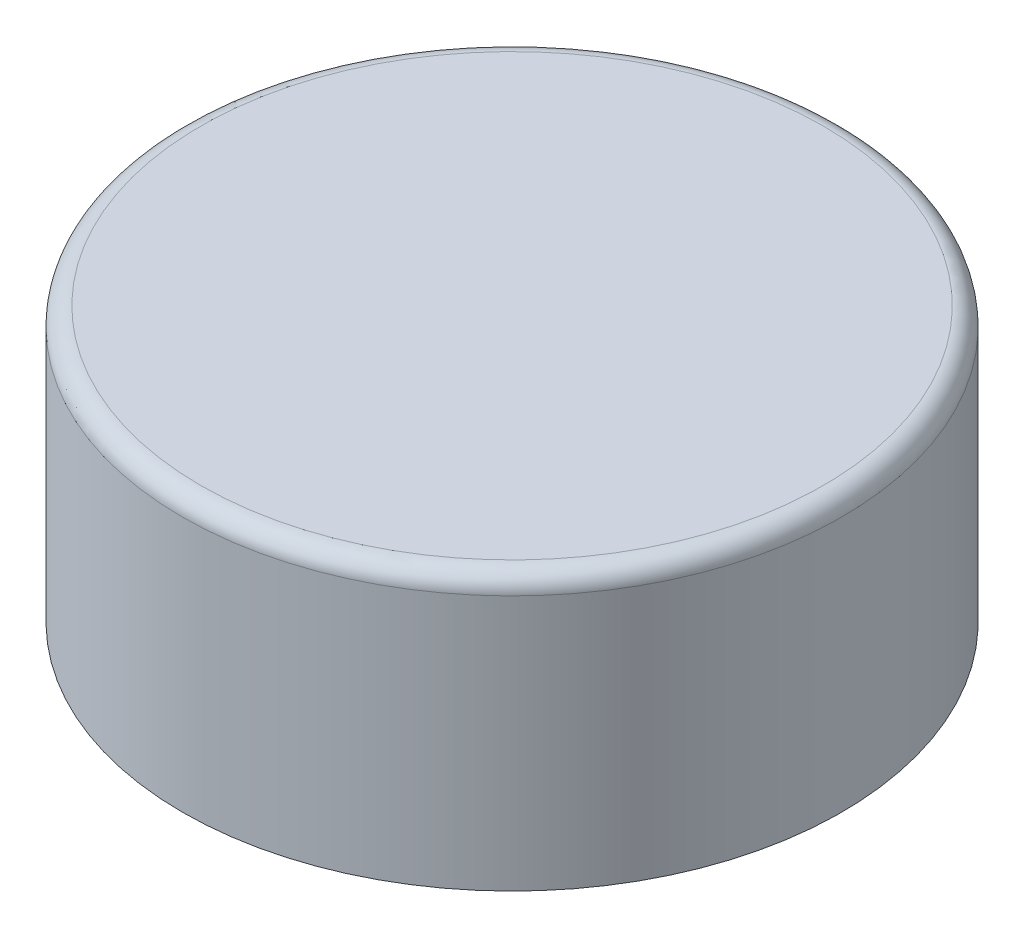
ISO-10303-21;
HEADER;
FILE_DESCRIPTION(('STEP AP214'),'2;1');
FILE_NAME('part.step','',(''),(''),'','','');
FILE_SCHEMA(('AUTOMOTIVE_DESIGN { 1 0 10303 214 1 1 1 1 }'));
ENDSEC;
DATA;
#1=APPLICATION_CONTEXT('core data for automotive mechanical design processes');
#2=APPLICATION_PROTOCOL_DEFINITION('international standard','automotive_design',2000,#1);
#3=PRODUCT_CONTEXT('',#1,'mechanical');
#4=PRODUCT('Part','Part','',(#3));
#5=PRODUCT_RELATED_PRODUCT_CATEGORY('part','',(#4));
#6=PRODUCT_DEFINITION_FORMATION('','',#4);
#7=PRODUCT_DEFINITION_CONTEXT('part definition',#1,'design');
#8=PRODUCT_DEFINITION('design','',#6,#7);
#9=PRODUCT_DEFINITION_SHAPE('','',#8);
#10=(LENGTH_UNIT() NAMED_UNIT(*) SI_UNIT(.MILLI.,.METRE.));
#11=(NAMED_UNIT(*) PLANE_ANGLE_UNIT() SI_UNIT($,.RADIAN.));
#12=(NAMED_UNIT(*) SI_UNIT($,.STERADIAN.) SOLID_ANGLE_UNIT());
#13=UNCERTAINTY_MEASURE_WITH_UNIT(LENGTH_MEASURE(1.E-05),#10,'distance_accuracy_value','');
#14=(GEOMETRIC_REPRESENTATION_CONTEXT(3) GLOBAL_UNCERTAINTY_ASSIGNED_CONTEXT((#13)) GLOBAL_UNIT_ASSIGNED_CONTEXT((#10,
#11,#12)) REPRESENTATION_CONTEXT('',''));
#15=CARTESIAN_POINT('',(0.,0.,0.));
#16=DIRECTION('',(0.,0.,1.));
#17=DIRECTION('',(1.,0.,0.));
#18=AXIS2_PLACEMENT_3D('',#15,#16,#17);
#19=CARTESIAN_POINT('',(0.,14.,0.));
#20=DIRECTION('',(0.,1.,0.));
#21=DIRECTION('',(0.,0.,1.));
#22=AXIS2_PLACEMENT_3D('',#19,#20,#21);
#23=TOROIDAL_SURFACE('',#22,17.05,1.);
#24=CARTESIAN_POINT('',(0.,15.,0.));
#25=DIRECTION('',(0.,1.,0.));
#26=DIRECTION('',(0.,0.,1.));
#27=AXIS2_PLACEMENT_3D('',#24,#25,#26);
#28=CIRCLE('',#27,17.05);
#29=CARTESIAN_POINT('',(0.,15.,17.05));
#30=VERTEX_POINT('',#29);
#31=EDGE_CURVE('E57',#30,#30,#28,.T.);
#32=ORIENTED_EDGE('',*,*,#31,.F.);
#33=EDGE_LOOP('',(#32));
#34=FACE_BOUND('',#33,.T.);
#35=CARTESIAN_POINT('',(0.,14.,0.));
#36=DIRECTION('',(0.,-1.,0.));
#37=DIRECTION('',(0.,0.,1.));
#38=AXIS2_PLACEMENT_3D('',#35,#36,#37);
#39=CIRCLE('',#38,18.05);
#40=CARTESIAN_POINT('',(0.,14.,18.05));
#41=VERTEX_POINT('',#40);
#42=EDGE_CURVE('E67',#41,#41,#39,.T.);
#43=ORIENTED_EDGE('',*,*,#42,.F.);
#44=EDGE_LOOP('',(#43));
#45=FACE_BOUND('',#44,.T.);
#46=ADVANCED_FACE('F17',(#34,#45),#23,.T.);
#47=CARTESIAN_POINT('',(0.,8.,0.));
#48=DIRECTION('',(0.,-1.,0.));
#49=DIRECTION('',(0.,0.,-1.));
#50=AXIS2_PLACEMENT_3D('',#47,#48,#49);
#51=PLANE('',#50);
#52=CARTESIAN_POINT('',(0.,8.,0.));
#53=DIRECTION('',(0.,-1.,0.));
#54=DIRECTION('',(0.,0.,-1.));
#55=AXIS2_PLACEMENT_3D('',#52,#53,#54);
#56=CIRCLE('',#55,15.55);
#57=CARTESIAN_POINT('',(0.,8.,-15.55));
#58=VERTEX_POINT('',#57);
#59=EDGE_CURVE('E11',#58,#58,#56,.T.);
#60=ORIENTED_EDGE('',*,*,#59,.T.);
#61=EDGE_LOOP('',(#60));
#62=FACE_BOUND('',#61,.T.);
#63=ADVANCED_FACE('F132',(#62),#51,.T.);
#64=CARTESIAN_POINT('',(0.,8.,0.));
#65=DIRECTION('',(0.,-1.,0.));
#66=DIRECTION('',(0.,0.,-1.));
#67=AXIS2_PLACEMENT_3D('',#64,#65,#66);
#68=CYLINDRICAL_SURFACE('',#67,15.55);
#69=ORIENTED_EDGE('',*,*,#59,.F.);
#70=EDGE_LOOP('',(#69));
#71=FACE_BOUND('',#70,.T.);
#72=CARTESIAN_POINT('',(0.,0.,0.));
#73=DIRECTION('',(0.,-1.,0.));
#74=DIRECTION('',(0.,0.,-1.));
#75=AXIS2_PLACEMENT_3D('',#72,#73,#74);
#76=CIRCLE('',#75,15.55);
#77=CARTESIAN_POINT('',(0.,0.,-15.55));
#78=VERTEX_POINT('',#77);
#79=EDGE_CURVE('E25',#78,#78,#76,.T.);
#80=ORIENTED_EDGE('',*,*,#79,.T.);
#81=EDGE_LOOP('',(#80));
#82=FACE_BOUND('',#81,.T.);
#83=ADVANCED_FACE('F123',(#71,#82),#68,.F.);
#84=CARTESIAN_POINT('',(0.,0.,0.));
#85=DIRECTION('',(0.,1.,0.));
#86=DIRECTION('',(1.,0.,0.));
#87=AXIS2_PLACEMENT_3D('',#84,#85,#86);
#88=PLANE('',#87);
#89=ORIENTED_EDGE('',*,*,#79,.F.);
#90=EDGE_LOOP('',(#89));
#91=FACE_BOUND('',#90,.T.);
#92=CARTESIAN_POINT('',(0.,0.,0.));
#93=DIRECTION('',(0.,1.,0.));
#94=DIRECTION('',(0.,0.,1.));
#95=AXIS2_PLACEMENT_3D('',#92,#93,#94);
#96=CIRCLE('',#95,18.05);
#97=CARTESIAN_POINT('',(0.,0.,18.05));
#98=VERTEX_POINT('',#97);
#99=EDGE_CURVE('E61',#98,#98,#96,.T.);
#100=ORIENTED_EDGE('',*,*,#99,.F.);
#101=EDGE_LOOP('',(#100));
#102=FACE_BOUND('',#101,.T.);
#103=ADVANCED_FACE('F114',(#91,#102),#88,.F.);
#104=CARTESIAN_POINT('',(0.,10.,0.));
#105=DIRECTION('',(0.,-1.,0.));
#106=DIRECTION('',(0.,0.,-1.));
#107=AXIS2_PLACEMENT_3D('',#104,#105,#106);
#108=CYLINDRICAL_SURFACE('',#107,18.05);
#109=ORIENTED_EDGE('',*,*,#42,.T.);
#110=EDGE_LOOP('',(#109));
#111=FACE_BOUND('',#110,.T.);
#112=ORIENTED_EDGE('',*,*,#99,.T.);
#113=EDGE_LOOP('',(#112));
#114=FACE_BOUND('',#113,.T.);
#115=ADVANCED_FACE('F107',(#111,#114),#108,.T.);
#116=CARTESIAN_POINT('',(0.,15.,0.));
#117=DIRECTION('',(0.,1.,0.));
#118=DIRECTION('',(1.,0.,0.));
#119=AXIS2_PLACEMENT_3D('',#116,#117,#118);
#120=PLANE('',#119);
#121=ORIENTED_EDGE('',*,*,#31,.T.);
#122=EDGE_LOOP('',(#121));
#123=FACE_BOUND('',#122,.T.);
#124=ADVANCED_FACE('F58',(#123),#120,.T.);
#125=CLOSED_SHELL('',(#46,#63,#83,#103,#115,#124));
#126=MANIFOLD_SOLID_BREP('B1',#125);
#127=ADVANCED_BREP_SHAPE_REPRESENTATION('',(#18,#126),#14);
#128=SHAPE_DEFINITION_REPRESENTATION(#9,#127);
ENDSEC;
END-ISO-10303-21;
